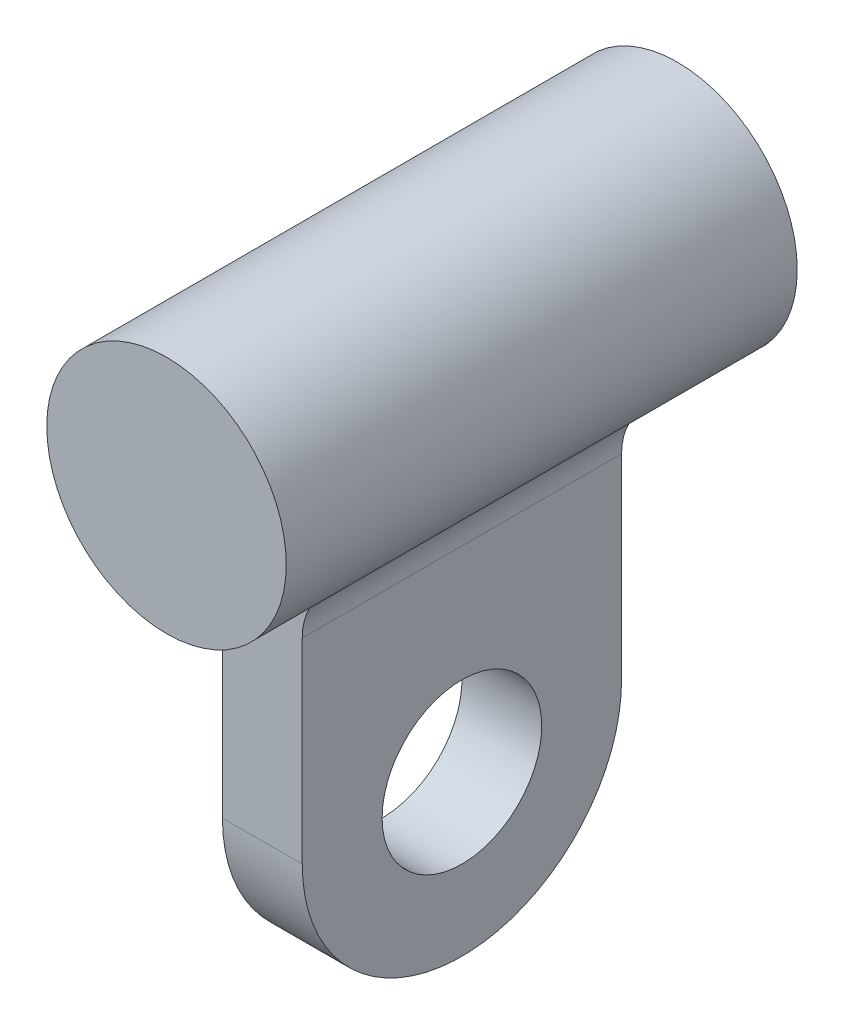
ISO-10303-21;
HEADER;
FILE_DESCRIPTION(('STEP AP214'),'2;1');
FILE_NAME('part.step','',(''),(''),'','','');
FILE_SCHEMA(('AUTOMOTIVE_DESIGN { 1 0 10303 214 1 1 1 1 }'));
ENDSEC;
DATA;
#1=APPLICATION_CONTEXT('core data for automotive mechanical design processes');
#2=APPLICATION_PROTOCOL_DEFINITION('international standard','automotive_design',2000,#1);
#3=PRODUCT_CONTEXT('',#1,'mechanical');
#4=PRODUCT('Part','Part','',(#3));
#5=PRODUCT_RELATED_PRODUCT_CATEGORY('part','',(#4));
#6=PRODUCT_DEFINITION_FORMATION('','',#4);
#7=PRODUCT_DEFINITION_CONTEXT('part definition',#1,'design');
#8=PRODUCT_DEFINITION('design','',#6,#7);
#9=PRODUCT_DEFINITION_SHAPE('','',#8);
#10=(LENGTH_UNIT() NAMED_UNIT(*) SI_UNIT(.MILLI.,.METRE.));
#11=(NAMED_UNIT(*) PLANE_ANGLE_UNIT() SI_UNIT($,.RADIAN.));
#12=(NAMED_UNIT(*) SI_UNIT($,.STERADIAN.) SOLID_ANGLE_UNIT());
#13=UNCERTAINTY_MEASURE_WITH_UNIT(LENGTH_MEASURE(1.E-05),#10,'distance_accuracy_value','');
#14=(GEOMETRIC_REPRESENTATION_CONTEXT(3) GLOBAL_UNCERTAINTY_ASSIGNED_CONTEXT((#13)) GLOBAL_UNIT_ASSIGNED_CONTEXT((#10,
#11,#12)) REPRESENTATION_CONTEXT('',''));
#15=CARTESIAN_POINT('',(0.,0.,0.));
#16=DIRECTION('',(0.,0.,1.));
#17=DIRECTION('',(1.,0.,0.));
#18=AXIS2_PLACEMENT_3D('',#15,#16,#17);
#19=CARTESIAN_POINT('',(-79.1940889650291,-29.05,3.81000000000001));
#20=DIRECTION('',(1.,0.,0.));
#21=DIRECTION('',(0.,0.,-1.));
#22=AXIS2_PLACEMENT_3D('',#19,#20,#21);
#23=PLANE('',#22);
#24=CARTESIAN_POINT('',(-79.1940889650291,-22.7,10.16));
#25=DIRECTION('',(1.,0.,0.));
#26=DIRECTION('',(0.,0.,-1.));
#27=AXIS2_PLACEMENT_3D('',#24,#25,#26);
#28=CIRCLE('',#27,3.175);
#29=CARTESIAN_POINT('',(-79.1940889650291,-22.7,13.335));
#30=VERTEX_POINT('',#29);
#31=EDGE_CURVE('E95',#30,#30,#28,.T.);
#32=ORIENTED_EDGE('',*,*,#31,.F.);
#33=EDGE_LOOP('',(#32));
#34=FACE_BOUND('',#33,.T.);
#35=DIRECTION('',(0.,1.,0.));
#36=VECTOR('',#35,1.);
#37=CARTESIAN_POINT('',(-79.1940889650291,-29.05,3.81000000000001));
#38=LINE('',#37,#36);
#39=CARTESIAN_POINT('',(-79.1940889650291,-22.7,3.81000000000001));
#40=VERTEX_POINT('',#39);
#41=CARTESIAN_POINT('',(-79.1940889650291,-14.9141389426208,3.81000000000001));
#42=VERTEX_POINT('',#41);
#43=EDGE_CURVE('E102',#40,#42,#38,.T.);
#44=ORIENTED_EDGE('',*,*,#43,.T.);
#45=DIRECTION('',(0.,0.,-1.));
#46=VECTOR('',#45,1.);
#47=CARTESIAN_POINT('',(-79.1940889650291,-14.9141389426208,3.81000000000001));
#48=LINE('',#47,#46);
#49=CARTESIAN_POINT('',(-79.1940889650291,-14.9141389426208,16.51));
#50=VERTEX_POINT('',#49);
#51=EDGE_CURVE('E129',#42,#50,#48,.F.);
#52=ORIENTED_EDGE('',*,*,#51,.T.);
#53=DIRECTION('',(0.,1.,0.));
#54=VECTOR('',#53,1.);
#55=CARTESIAN_POINT('',(-79.1940889650291,-29.05,16.51));
#56=LINE('',#55,#54);
#57=CARTESIAN_POINT('',(-79.1940889650291,-22.7,16.51));
#58=VERTEX_POINT('',#57);
#59=EDGE_CURVE('E109',#58,#50,#56,.T.);
#60=ORIENTED_EDGE('',*,*,#59,.F.);
#61=CARTESIAN_POINT('',(-79.1940889650291,-22.7,10.16));
#62=DIRECTION('',(1.,0.,0.));
#63=DIRECTION('',(0.,0.,-1.));
#64=AXIS2_PLACEMENT_3D('',#61,#62,#63);
#65=CIRCLE('',#64,6.35);
#66=EDGE_CURVE('E111',#58,#40,#65,.T.);
#67=ORIENTED_EDGE('',*,*,#66,.T.);
#68=EDGE_LOOP('',(#44,#52,#60,#67));
#69=FACE_BOUND('',#68,.T.);
#70=ADVANCED_FACE('F34',(#34,#69),#23,.T.);
#71=CARTESIAN_POINT('',(-82.3690889650291,-29.05,3.81000000000001));
#72=DIRECTION('',(-1.,0.,0.));
#73=DIRECTION('',(0.,0.,1.));
#74=AXIS2_PLACEMENT_3D('',#71,#72,#73);
#75=PLANE('',#74);
#76=CARTESIAN_POINT('',(-82.3690889650291,-22.7,10.16));
#77=DIRECTION('',(-1.,0.,0.));
#78=DIRECTION('',(0.,0.,1.));
#79=AXIS2_PLACEMENT_3D('',#76,#77,#78);
#80=CIRCLE('',#79,3.175);
#81=CARTESIAN_POINT('',(-82.3690889650291,-22.7,13.335));
#82=VERTEX_POINT('',#81);
#83=EDGE_CURVE('E156',#82,#82,#80,.T.);
#84=ORIENTED_EDGE('',*,*,#83,.F.);
#85=EDGE_LOOP('',(#84));
#86=FACE_BOUND('',#85,.T.);
#87=DIRECTION('',(0.,1.,0.));
#88=VECTOR('',#87,1.);
#89=CARTESIAN_POINT('',(-82.3690889650291,-29.05,16.51));
#90=LINE('',#89,#88);
#91=CARTESIAN_POINT('',(-82.3690889650291,-22.7,16.51));
#92=VERTEX_POINT('',#91);
#93=CARTESIAN_POINT('',(-82.3690889650291,-14.9141389426208,16.51));
#94=VERTEX_POINT('',#93);
#95=EDGE_CURVE('E107',#92,#94,#90,.T.);
#96=ORIENTED_EDGE('',*,*,#95,.T.);
#97=DIRECTION('',(0.,0.,-1.));
#98=VECTOR('',#97,1.);
#99=CARTESIAN_POINT('',(-82.3690889650291,-14.9141389426208,3.81000000000001));
#100=LINE('',#99,#98);
#101=CARTESIAN_POINT('',(-82.3690889650291,-14.9141389426208,3.81000000000001));
#102=VERTEX_POINT('',#101);
#103=EDGE_CURVE('E55',#94,#102,#100,.T.);
#104=ORIENTED_EDGE('',*,*,#103,.T.);
#105=DIRECTION('',(0.,1.,0.));
#106=VECTOR('',#105,1.);
#107=CARTESIAN_POINT('',(-82.3690889650291,-29.05,3.81000000000001));
#108=LINE('',#107,#106);
#109=CARTESIAN_POINT('',(-82.3690889650291,-22.7,3.81000000000001));
#110=VERTEX_POINT('',#109);
#111=EDGE_CURVE('E99',#110,#102,#108,.T.);
#112=ORIENTED_EDGE('',*,*,#111,.F.);
#113=CARTESIAN_POINT('',(-82.3690889650291,-22.7,10.16));
#114=DIRECTION('',(-1.,0.,0.));
#115=DIRECTION('',(0.,0.,1.));
#116=AXIS2_PLACEMENT_3D('',#113,#114,#115);
#117=CIRCLE('',#116,6.35);
#118=EDGE_CURVE('E88',#110,#92,#117,.T.);
#119=ORIENTED_EDGE('',*,*,#118,.T.);
#120=EDGE_LOOP('',(#96,#104,#112,#119));
#121=FACE_BOUND('',#120,.T.);
#122=ADVANCED_FACE('F106',(#86,#121),#75,.T.);
#123=CARTESIAN_POINT('',(-79.1940889650291,-29.05,3.81000000000001));
#124=DIRECTION('',(0.,0.,-1.));
#125=DIRECTION('',(-1.,0.,0.));
#126=AXIS2_PLACEMENT_3D('',#123,#124,#125);
#127=PLANE('',#126);
#128=ORIENTED_EDGE('',*,*,#43,.F.);
#129=DIRECTION('',(-1.,0.,0.));
#130=VECTOR('',#129,1.);
#131=CARTESIAN_POINT('',(-76.0190889650291,-22.7,3.81000000000001));
#132=LINE('',#131,#130);
#133=EDGE_CURVE('E91',#40,#110,#132,.T.);
#134=ORIENTED_EDGE('',*,*,#133,.T.);
#135=ORIENTED_EDGE('',*,*,#111,.T.);
#136=CARTESIAN_POINT('',(-84.9090889650291,-14.9141389426208,3.81000000000001));
#137=DIRECTION('',(0.,0.,-1.));
#138=DIRECTION('',(-1.,0.,0.));
#139=AXIS2_PLACEMENT_3D('',#136,#137,#138);
#140=CIRCLE('',#139,2.54);
#141=CARTESIAN_POINT('',(-83.473436791116,-12.8187862669266,3.81000000000001));
#142=VERTEX_POINT('',#141);
#143=EDGE_CURVE('E12',#102,#142,#140,.F.);
#144=ORIENTED_EDGE('',*,*,#143,.T.);
#145=CARTESIAN_POINT('',(-80.7815889650291,-8.89000000000001,3.81));
#146=DIRECTION('',(0.,0.,-1.));
#147=DIRECTION('',(-1.,0.,0.));
#148=AXIS2_PLACEMENT_3D('',#145,#146,#147);
#149=CIRCLE('',#148,4.7625);
#150=CARTESIAN_POINT('',(-78.0897411389421,-12.8187862669266,3.81));
#151=VERTEX_POINT('',#150);
#152=EDGE_CURVE('E118',#151,#142,#149,.T.);
#153=ORIENTED_EDGE('',*,*,#152,.F.);
#154=CARTESIAN_POINT('',(-76.6540889650291,-14.9141389426208,3.81));
#155=DIRECTION('',(0.,0.,-1.));
#156=DIRECTION('',(-1.,0.,0.));
#157=AXIS2_PLACEMENT_3D('',#154,#155,#156);
#158=CIRCLE('',#157,2.54);
#159=EDGE_CURVE('E132',#151,#42,#158,.F.);
#160=ORIENTED_EDGE('',*,*,#159,.T.);
#161=EDGE_LOOP('',(#128,#134,#135,#144,#153,#160));
#162=FACE_BOUND('',#161,.T.);
#163=ADVANCED_FACE('F98',(#162),#127,.T.);
#164=CARTESIAN_POINT('',(-80.7815889650291,-8.89000000000001,20.32));
#165=DIRECTION('',(0.,0.,-1.));
#166=DIRECTION('',(-1.,0.,0.));
#167=AXIS2_PLACEMENT_3D('',#164,#165,#166);
#168=CYLINDRICAL_SURFACE('',#167,4.7625);
#169=DIRECTION('',(0.,0.,-1.));
#170=VECTOR('',#169,1.);
#171=CARTESIAN_POINT('',(-78.0897411389421,-12.8187862669266,20.32));
#172=LINE('',#171,#170);
#173=CARTESIAN_POINT('',(-78.0897411389421,-12.8187862669266,16.51));
#174=VERTEX_POINT('',#173);
#175=EDGE_CURVE('E126',#174,#151,#172,.T.);
#176=ORIENTED_EDGE('',*,*,#175,.T.);
#177=ORIENTED_EDGE('',*,*,#152,.T.);
#178=DIRECTION('',(0.,0.,-1.));
#179=VECTOR('',#178,1.);
#180=CARTESIAN_POINT('',(-83.473436791116,-12.8187862669266,20.32));
#181=LINE('',#180,#179);
#182=CARTESIAN_POINT('',(-83.473436791116,-12.8187862669266,16.51));
#183=VERTEX_POINT('',#182);
#184=EDGE_CURVE('E103',#142,#183,#181,.F.);
#185=ORIENTED_EDGE('',*,*,#184,.T.);
#186=CARTESIAN_POINT('',(-80.7815889650291,-8.89000000000001,16.51));
#187=DIRECTION('',(0.,0.,1.));
#188=DIRECTION('',(1.,0.,0.));
#189=AXIS2_PLACEMENT_3D('',#186,#187,#188);
#190=CIRCLE('',#189,4.7625);
#191=EDGE_CURVE('E104',#183,#174,#190,.T.);
#192=ORIENTED_EDGE('',*,*,#191,.T.);
#193=EDGE_LOOP('',(#176,#177,#185,#192));
#194=FACE_BOUND('',#193,.T.);
#195=CARTESIAN_POINT('',(-80.7815889650291,-8.89000000000001,20.32));
#196=DIRECTION('',(0.,0.,1.));
#197=DIRECTION('',(1.,0.,0.));
#198=AXIS2_PLACEMENT_3D('',#195,#196,#197);
#199=CIRCLE('',#198,4.7625);
#200=CARTESIAN_POINT('',(-76.0190889650291,-8.89000000000001,20.32));
#201=VERTEX_POINT('',#200);
#202=EDGE_CURVE('E115',#201,#201,#199,.T.);
#203=ORIENTED_EDGE('',*,*,#202,.F.);
#204=EDGE_LOOP('',(#203));
#205=FACE_BOUND('',#204,.T.);
#206=CARTESIAN_POINT('',(-80.7815889650291,-8.89000000000001,0.));
#207=DIRECTION('',(0.,0.,1.));
#208=DIRECTION('',(1.,0.,0.));
#209=AXIS2_PLACEMENT_3D('',#206,#207,#208);
#210=CIRCLE('',#209,4.7625);
#211=CARTESIAN_POINT('',(-76.0190889650291,-8.89000000000001,0.));
#212=VERTEX_POINT('',#211);
#213=EDGE_CURVE('E119',#212,#212,#210,.T.);
#214=ORIENTED_EDGE('',*,*,#213,.T.);
#215=EDGE_LOOP('',(#214));
#216=FACE_BOUND('',#215,.T.);
#217=ADVANCED_FACE('F146',(#194,#205,#216),#168,.T.);
#218=CARTESIAN_POINT('',(-80.7815889650291,-8.89000000000001,20.32));
#219=DIRECTION('',(0.,0.,1.));
#220=DIRECTION('',(1.,0.,0.));
#221=AXIS2_PLACEMENT_3D('',#218,#219,#220);
#222=PLANE('',#221);
#223=ORIENTED_EDGE('',*,*,#202,.T.);
#224=EDGE_LOOP('',(#223));
#225=FACE_BOUND('',#224,.T.);
#226=ADVANCED_FACE('F174',(#225),#222,.T.);
#227=CARTESIAN_POINT('',(-80.7815889650291,-8.89000000000001,0.));
#228=DIRECTION('',(0.,0.,1.));
#229=DIRECTION('',(1.,0.,0.));
#230=AXIS2_PLACEMENT_3D('',#227,#228,#229);
#231=PLANE('',#230);
#232=ORIENTED_EDGE('',*,*,#213,.F.);
#233=EDGE_LOOP('',(#232));
#234=FACE_BOUND('',#233,.T.);
#235=ADVANCED_FACE('F177',(#234),#231,.F.);
#236=CARTESIAN_POINT('',(-79.1940889650291,-29.05,16.51));
#237=DIRECTION('',(0.,0.,1.));
#238=DIRECTION('',(1.,0.,0.));
#239=AXIS2_PLACEMENT_3D('',#236,#237,#238);
#240=PLANE('',#239);
#241=DIRECTION('',(-1.,0.,0.));
#242=VECTOR('',#241,1.);
#243=CARTESIAN_POINT('',(-76.0190889650291,-22.7,16.51));
#244=LINE('',#243,#242);
#245=EDGE_CURVE('E94',#58,#92,#244,.T.);
#246=ORIENTED_EDGE('',*,*,#245,.F.);
#247=ORIENTED_EDGE('',*,*,#59,.T.);
#248=CARTESIAN_POINT('',(-76.6540889650291,-14.9141389426208,16.51));
#249=DIRECTION('',(0.,0.,1.));
#250=DIRECTION('',(1.,0.,0.));
#251=AXIS2_PLACEMENT_3D('',#248,#249,#250);
#252=CIRCLE('',#251,2.54);
#253=EDGE_CURVE('E134',#50,#174,#252,.F.);
#254=ORIENTED_EDGE('',*,*,#253,.T.);
#255=ORIENTED_EDGE('',*,*,#191,.F.);
#256=CARTESIAN_POINT('',(-84.9090889650291,-14.9141389426208,16.51));
#257=DIRECTION('',(0.,0.,1.));
#258=DIRECTION('',(1.,0.,0.));
#259=AXIS2_PLACEMENT_3D('',#256,#257,#258);
#260=CIRCLE('',#259,2.54);
#261=EDGE_CURVE('E42',#183,#94,#260,.F.);
#262=ORIENTED_EDGE('',*,*,#261,.T.);
#263=ORIENTED_EDGE('',*,*,#95,.F.);
#264=EDGE_LOOP('',(#246,#247,#254,#255,#262,#263));
#265=FACE_BOUND('',#264,.T.);
#266=ADVANCED_FACE('F139',(#265),#240,.T.);
#267=CARTESIAN_POINT('',(-76.0190889650291,-22.7,10.16));
#268=DIRECTION('',(-1.,0.,0.));
#269=DIRECTION('',(0.,0.,1.));
#270=AXIS2_PLACEMENT_3D('',#267,#268,#269);
#271=CYLINDRICAL_SURFACE('',#270,6.35);
#272=ORIENTED_EDGE('',*,*,#245,.T.);
#273=ORIENTED_EDGE('',*,*,#118,.F.);
#274=ORIENTED_EDGE('',*,*,#133,.F.);
#275=ORIENTED_EDGE('',*,*,#66,.F.);
#276=EDGE_LOOP('',(#272,#273,#274,#275));
#277=FACE_BOUND('',#276,.T.);
#278=ADVANCED_FACE('F90',(#277),#271,.T.);
#279=CARTESIAN_POINT('',(-76.0190889650291,-22.7,10.16));
#280=DIRECTION('',(-1.,0.,0.));
#281=DIRECTION('',(0.,0.,1.));
#282=AXIS2_PLACEMENT_3D('',#279,#280,#281);
#283=CYLINDRICAL_SURFACE('',#282,3.175);
#284=CARTESIAN_POINT('',(-79.1940889650291,-22.7,13.335));
#285=CARTESIAN_POINT('',(-79.2271618816957,-22.7,13.335));
#286=CARTESIAN_POINT('',(-79.2602347983624,-22.7,13.335));
#287=CARTESIAN_POINT('',(-79.3263806316957,-22.7,13.335));
#288=CARTESIAN_POINT('',(-79.3594535483624,-22.7,13.335));
#289=CARTESIAN_POINT('',(-79.4255993816957,-22.7,13.335));
#290=CARTESIAN_POINT('',(-79.4586722983624,-22.7,13.335));
#291=CARTESIAN_POINT('',(-79.5248181316957,-22.7,13.335));
#292=CARTESIAN_POINT('',(-79.5578910483624,-22.7,13.335));
#293=CARTESIAN_POINT('',(-79.6240368816957,-22.7,13.335));
#294=CARTESIAN_POINT('',(-79.6571097983624,-22.7,13.335));
#295=CARTESIAN_POINT('',(-79.7232556316957,-22.7,13.335));
#296=CARTESIAN_POINT('',(-79.7563285483624,-22.7,13.335));
#297=CARTESIAN_POINT('',(-79.8224743816957,-22.7,13.335));
#298=CARTESIAN_POINT('',(-79.8555472983624,-22.7,13.335));
#299=CARTESIAN_POINT('',(-79.9216931316957,-22.7,13.335));
#300=CARTESIAN_POINT('',(-79.9547660483624,-22.7,13.335));
#301=CARTESIAN_POINT('',(-80.0209118816957,-22.7,13.335));
#302=CARTESIAN_POINT('',(-80.0539847983624,-22.7,13.335));
#303=CARTESIAN_POINT('',(-80.1201306316957,-22.7,13.335));
#304=CARTESIAN_POINT('',(-80.1532035483624,-22.7,13.335));
#305=CARTESIAN_POINT('',(-80.2193493816957,-22.7,13.335));
#306=CARTESIAN_POINT('',(-80.2524222983624,-22.7,13.335));
#307=CARTESIAN_POINT('',(-80.3185681316957,-22.7,13.335));
#308=CARTESIAN_POINT('',(-80.3516410483624,-22.7,13.335));
#309=CARTESIAN_POINT('',(-80.4177868816957,-22.7,13.335));
#310=CARTESIAN_POINT('',(-80.4508597983624,-22.7,13.335));
#311=CARTESIAN_POINT('',(-80.5170056316957,-22.7,13.335));
#312=CARTESIAN_POINT('',(-80.5500785483624,-22.7,13.335));
#313=CARTESIAN_POINT('',(-80.6162243816957,-22.7,13.335));
#314=CARTESIAN_POINT('',(-80.6492972983624,-22.7,13.335));
#315=CARTESIAN_POINT('',(-80.7154431316957,-22.7,13.335));
#316=CARTESIAN_POINT('',(-80.7485160483624,-22.7,13.335));
#317=CARTESIAN_POINT('',(-80.8146618816957,-22.7,13.335));
#318=CARTESIAN_POINT('',(-80.8477347983624,-22.7,13.335));
#319=CARTESIAN_POINT('',(-80.9138806316957,-22.7,13.335));
#320=CARTESIAN_POINT('',(-80.9469535483624,-22.7,13.335));
#321=CARTESIAN_POINT('',(-81.0130993816957,-22.7,13.335));
#322=CARTESIAN_POINT('',(-81.0461722983624,-22.7,13.335));
#323=CARTESIAN_POINT('',(-81.1123181316957,-22.7,13.335));
#324=CARTESIAN_POINT('',(-81.1453910483624,-22.7,13.335));
#325=CARTESIAN_POINT('',(-81.2115368816957,-22.7,13.335));
#326=CARTESIAN_POINT('',(-81.2446097983624,-22.7,13.335));
#327=CARTESIAN_POINT('',(-81.3107556316957,-22.7,13.335));
#328=CARTESIAN_POINT('',(-81.3438285483624,-22.7,13.335));
#329=CARTESIAN_POINT('',(-81.4099743816957,-22.7,13.335));
#330=CARTESIAN_POINT('',(-81.4430472983624,-22.7,13.335));
#331=CARTESIAN_POINT('',(-81.5091931316957,-22.7,13.335));
#332=CARTESIAN_POINT('',(-81.5422660483624,-22.7,13.335));
#333=CARTESIAN_POINT('',(-81.6084118816957,-22.7,13.335));
#334=CARTESIAN_POINT('',(-81.6414847983624,-22.7,13.335));
#335=CARTESIAN_POINT('',(-81.7076306316957,-22.7,13.335));
#336=CARTESIAN_POINT('',(-81.7407035483624,-22.7,13.335));
#337=CARTESIAN_POINT('',(-81.8068493816957,-22.7,13.335));
#338=CARTESIAN_POINT('',(-81.8399222983624,-22.7,13.335));
#339=CARTESIAN_POINT('',(-81.9060681316957,-22.7,13.335));
#340=CARTESIAN_POINT('',(-81.9391410483624,-22.7,13.335));
#341=CARTESIAN_POINT('',(-82.0052868816957,-22.7,13.335));
#342=CARTESIAN_POINT('',(-82.0383597983624,-22.7,13.335));
#343=CARTESIAN_POINT('',(-82.1045056316957,-22.7,13.335));
#344=CARTESIAN_POINT('',(-82.1375785483624,-22.7,13.335));
#345=CARTESIAN_POINT('',(-82.2037243816957,-22.7,13.335));
#346=CARTESIAN_POINT('',(-82.2367972983624,-22.7,13.335));
#347=CARTESIAN_POINT('',(-82.3029431316957,-22.7,13.335));
#348=CARTESIAN_POINT('',(-82.3360160483624,-22.7,13.335));
#349=CARTESIAN_POINT('',(-82.3690889650291,-22.7,13.335));
#350=B_SPLINE_CURVE_WITH_KNOTS('',3,(#284,#285,#286,#287,#288,#289,#290,#291,#292,#293,#294,
#295,#296,#297,#298,#299,#300,#301,#302,#303,#304,#305,#306,#307,#308,#309,#310,#311,#312,#313,
#314,#315,#316,#317,#318,#319,#320,#321,#322,#323,#324,#325,#326,#327,#328,#329,#330,#331,#332,
#333,#334,#335,#336,#337,#338,#339,#340,#341,#342,#343,#344,#345,#346,#347,#348,#349),
.UNSPECIFIED.,.F.,.F.,(4,2,2,2,2,2,2,2,2,2,2,2,2,2,2,2,2,2,2,2,2,2,2,2,2,2,2,2,2,2,2,2,4),(0.,
0.0992187500000047,0.198437500000009,0.29765625,0.396875000000005,0.49609375000001,0.5953125,
0.694531250000005,0.793749999999996,0.892968750000001,0.992187500000005,1.09140625,1.190625,
1.28984375000001,1.3890625,1.48828125,1.58749999999999,1.68671875,1.7859375,1.88515624999999,
1.984375,2.08359375,2.18281249999999,2.28203125,2.38124999999999,2.48046874999999,2.5796875,
2.67890624999999,2.77812499999999,2.87734375,2.97656249999999,3.07578124999999,
3.17499999999998),.UNSPECIFIED.);
#351=EDGE_CURVE('BSEAM160',#30,#82,#350,.T.);
#352=ORIENTED_EDGE('',*,*,#31,.T.);
#353=ORIENTED_EDGE('',*,*,#83,.T.);
#354=ORIENTED_EDGE('',*,*,#351,.T.);
#355=ORIENTED_EDGE('',*,*,#351,.F.);
#356=EDGE_LOOP('',(#352,#354,#353,#355));
#357=FACE_BOUND('',#356,.T.);
#358=ADVANCED_FACE('F160',(#357),#283,.F.);
#359=CARTESIAN_POINT('',(-76.6540889650291,-14.9141389426208,20.32));
#360=DIRECTION('',(0.,0.,-1.));
#361=DIRECTION('',(-1.,0.,0.));
#362=AXIS2_PLACEMENT_3D('',#359,#360,#361);
#363=CYLINDRICAL_SURFACE('',#362,2.54);
#364=ORIENTED_EDGE('',*,*,#253,.F.);
#365=ORIENTED_EDGE('',*,*,#51,.F.);
#366=ORIENTED_EDGE('',*,*,#159,.F.);
#367=ORIENTED_EDGE('',*,*,#175,.F.);
#368=EDGE_LOOP('',(#364,#365,#366,#367));
#369=FACE_BOUND('',#368,.T.);
#370=ADVANCED_FACE('F144',(#369),#363,.F.);
#371=CARTESIAN_POINT('',(-84.9090889650291,-14.9141389426208,20.32));
#372=DIRECTION('',(0.,0.,-1.));
#373=DIRECTION('',(-1.,0.,0.));
#374=AXIS2_PLACEMENT_3D('',#371,#372,#373);
#375=CYLINDRICAL_SURFACE('',#374,2.54);
#376=ORIENTED_EDGE('',*,*,#143,.F.);
#377=ORIENTED_EDGE('',*,*,#103,.F.);
#378=ORIENTED_EDGE('',*,*,#261,.F.);
#379=ORIENTED_EDGE('',*,*,#184,.F.);
#380=EDGE_LOOP('',(#376,#377,#378,#379));
#381=FACE_BOUND('',#380,.T.);
#382=ADVANCED_FACE('F36',(#381),#375,.F.);
#383=CLOSED_SHELL('',(#70,#122,#163,#217,#226,#235,#266,#278,#358,#370,#382));
#384=MANIFOLD_SOLID_BREP('B2',#383);
#385=ADVANCED_BREP_SHAPE_REPRESENTATION('',(#18,#384),#14);
#386=SHAPE_DEFINITION_REPRESENTATION(#9,#385);
ENDSEC;
END-ISO-10303-21;
